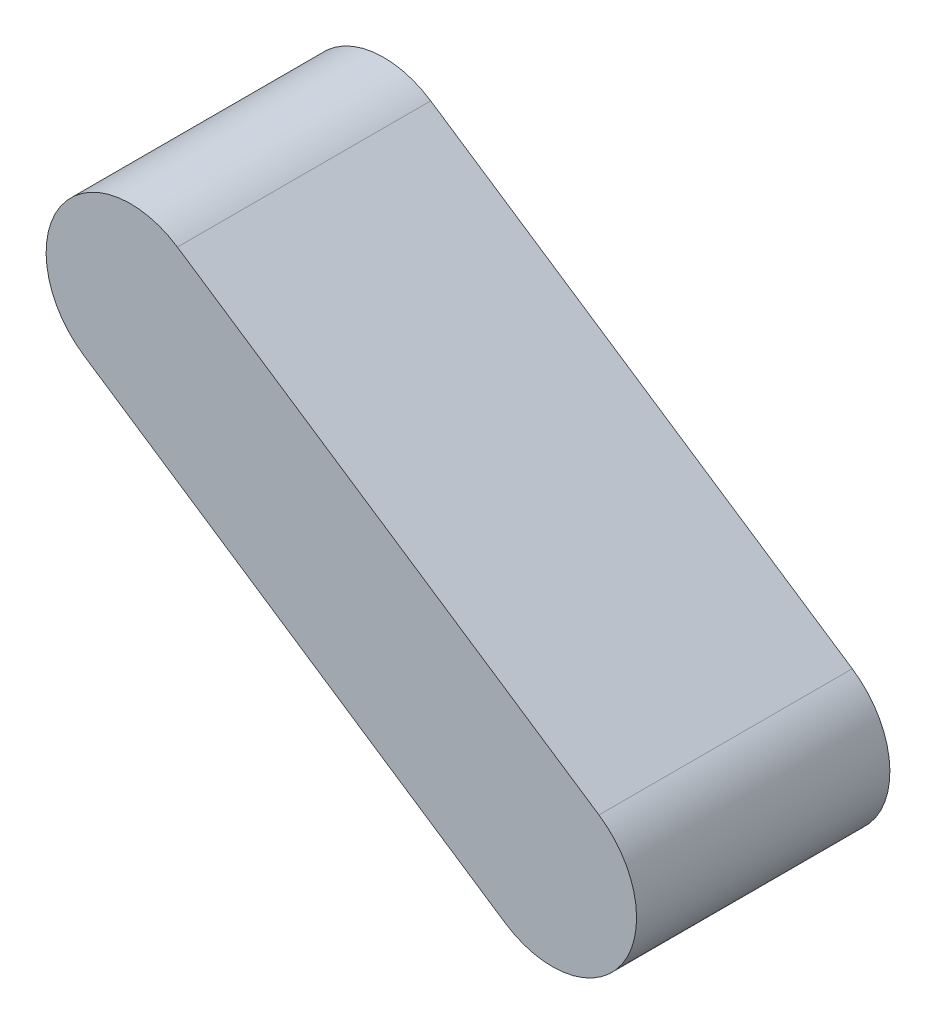
ISO-10303-21;
HEADER;
FILE_DESCRIPTION(('STEP AP214'),'2;1');
FILE_NAME('part.step','',(''),(''),'','','');
FILE_SCHEMA(('AUTOMOTIVE_DESIGN { 1 0 10303 214 1 1 1 1 }'));
ENDSEC;
DATA;
#1=APPLICATION_CONTEXT('core data for automotive mechanical design processes');
#2=APPLICATION_PROTOCOL_DEFINITION('international standard','automotive_design',2000,#1);
#3=PRODUCT_CONTEXT('',#1,'mechanical');
#4=PRODUCT('Part','Part','',(#3));
#5=PRODUCT_RELATED_PRODUCT_CATEGORY('part','',(#4));
#6=PRODUCT_DEFINITION_FORMATION('','',#4);
#7=PRODUCT_DEFINITION_CONTEXT('part definition',#1,'design');
#8=PRODUCT_DEFINITION('design','',#6,#7);
#9=PRODUCT_DEFINITION_SHAPE('','',#8);
#10=(LENGTH_UNIT() NAMED_UNIT(*) SI_UNIT(.MILLI.,.METRE.));
#11=(NAMED_UNIT(*) PLANE_ANGLE_UNIT() SI_UNIT($,.RADIAN.));
#12=(NAMED_UNIT(*) SI_UNIT($,.STERADIAN.) SOLID_ANGLE_UNIT());
#13=UNCERTAINTY_MEASURE_WITH_UNIT(LENGTH_MEASURE(1.E-05),#10,'distance_accuracy_value','');
#14=(GEOMETRIC_REPRESENTATION_CONTEXT(3) GLOBAL_UNCERTAINTY_ASSIGNED_CONTEXT((#13)) GLOBAL_UNIT_ASSIGNED_CONTEXT((#10,
#11,#12)) REPRESENTATION_CONTEXT('',''));
#15=CARTESIAN_POINT('',(0.,0.,0.));
#16=DIRECTION('',(0.,0.,1.));
#17=DIRECTION('',(1.,0.,0.));
#18=AXIS2_PLACEMENT_3D('',#15,#16,#17);
#19=CARTESIAN_POINT('',(0.,0.,15.));
#20=DIRECTION('',(0.,0.,-1.));
#21=DIRECTION('',(-1.,0.,0.));
#22=AXIS2_PLACEMENT_3D('',#19,#20,#21);
#23=CYLINDRICAL_SURFACE('',#22,10.);
#24=CARTESIAN_POINT('',(0.,0.,-15.));
#25=DIRECTION('',(0.,0.,1.));
#26=DIRECTION('',(1.,0.,0.));
#27=AXIS2_PLACEMENT_3D('',#24,#25,#26);
#28=CIRCLE('',#27,10.);
#29=CARTESIAN_POINT('',(-5.54634738523467,-8.32093929086739,-15.));
#30=VERTEX_POINT('',#29);
#31=CARTESIAN_POINT('',(5.54634738523467,8.32093929086739,-15.));
#32=VERTEX_POINT('',#31);
#33=EDGE_CURVE('E107',#30,#32,#28,.T.);
#34=ORIENTED_EDGE('',*,*,#33,.T.);
#35=DIRECTION('',(0.,0.,-1.));
#36=VECTOR('',#35,1.);
#37=CARTESIAN_POINT('',(5.54634738523467,8.32093929086739,15.));
#38=LINE('',#37,#36);
#39=CARTESIAN_POINT('',(5.54634738523467,8.32093929086739,15.));
#40=VERTEX_POINT('',#39);
#41=EDGE_CURVE('E11',#40,#32,#38,.T.);
#42=ORIENTED_EDGE('',*,*,#41,.F.);
#43=CARTESIAN_POINT('',(0.,0.,15.));
#44=DIRECTION('',(0.,0.,1.));
#45=DIRECTION('',(1.,0.,0.));
#46=AXIS2_PLACEMENT_3D('',#43,#44,#45);
#47=CIRCLE('',#46,10.);
#48=CARTESIAN_POINT('',(-5.54634738523467,-8.32093929086739,15.));
#49=VERTEX_POINT('',#48);
#50=EDGE_CURVE('E89',#49,#40,#47,.T.);
#51=ORIENTED_EDGE('',*,*,#50,.F.);
#52=DIRECTION('',(0.,0.,-1.));
#53=VECTOR('',#52,1.);
#54=CARTESIAN_POINT('',(-5.54634738523467,-8.32093929086739,15.));
#55=LINE('',#54,#53);
#56=EDGE_CURVE('E56',#49,#30,#55,.T.);
#57=ORIENTED_EDGE('',*,*,#56,.T.);
#58=EDGE_LOOP('',(#34,#42,#51,#57));
#59=FACE_BOUND('',#58,.T.);
#60=ADVANCED_FACE('F39',(#59),#23,.T.);
#61=CARTESIAN_POINT('',(5.54634738523467,8.32093929086739,15.));
#62=DIRECTION('',(-0.554634738523466,-0.832093929086739,0.));
#63=DIRECTION('',(0.832093929086739,-0.554634738523466,0.));
#64=AXIS2_PLACEMENT_3D('',#61,#62,#63);
#65=PLANE('',#64);
#66=DIRECTION('',(-0.832093929086739,0.554634738523466,0.));
#67=VECTOR('',#66,1.);
#68=CARTESIAN_POINT('',(5.54634738523467,8.32093929086739,-15.));
#69=LINE('',#68,#67);
#70=CARTESIAN_POINT('',(-44.3792883599697,41.5990236022754,-15.));
#71=VERTEX_POINT('',#70);
#72=EDGE_CURVE('E95',#32,#71,#69,.T.);
#73=ORIENTED_EDGE('',*,*,#72,.T.);
#74=DIRECTION('',(0.,0.,-1.));
#75=VECTOR('',#74,1.);
#76=CARTESIAN_POINT('',(-44.3792883599697,41.5990236022754,15.));
#77=LINE('',#76,#75);
#78=CARTESIAN_POINT('',(-44.3792883599697,41.5990236022754,15.));
#79=VERTEX_POINT('',#78);
#80=EDGE_CURVE('E48',#79,#71,#77,.T.);
#81=ORIENTED_EDGE('',*,*,#80,.F.);
#82=DIRECTION('',(-0.832093929086739,0.554634738523466,0.));
#83=VECTOR('',#82,1.);
#84=CARTESIAN_POINT('',(5.54634738523467,8.32093929086739,15.));
#85=LINE('',#84,#83);
#86=EDGE_CURVE('E82',#40,#79,#85,.T.);
#87=ORIENTED_EDGE('',*,*,#86,.F.);
#88=ORIENTED_EDGE('',*,*,#41,.T.);
#89=EDGE_LOOP('',(#73,#81,#87,#88));
#90=FACE_BOUND('',#89,.T.);
#91=ADVANCED_FACE('F94',(#90),#65,.F.);
#92=CARTESIAN_POINT('',(-49.9256357452043,33.278084311408,15.));
#93=DIRECTION('',(0.,0.,-1.));
#94=DIRECTION('',(-1.,0.,0.));
#95=AXIS2_PLACEMENT_3D('',#92,#93,#94);
#96=CYLINDRICAL_SURFACE('',#95,10.);
#97=CARTESIAN_POINT('',(-49.9256357452043,33.278084311408,-15.));
#98=DIRECTION('',(0.,0.,1.));
#99=DIRECTION('',(1.,0.,0.));
#100=AXIS2_PLACEMENT_3D('',#97,#98,#99);
#101=CIRCLE('',#100,10.);
#102=CARTESIAN_POINT('',(-55.471983130439,24.9571450205406,-15.));
#103=VERTEX_POINT('',#102);
#104=EDGE_CURVE('E112',#71,#103,#101,.T.);
#105=ORIENTED_EDGE('',*,*,#104,.T.);
#106=DIRECTION('',(0.,0.,-1.));
#107=VECTOR('',#106,1.);
#108=CARTESIAN_POINT('',(-55.471983130439,24.9571450205406,15.));
#109=LINE('',#108,#107);
#110=CARTESIAN_POINT('',(-55.471983130439,24.9571450205406,15.));
#111=VERTEX_POINT('',#110);
#112=EDGE_CURVE('E71',#111,#103,#109,.T.);
#113=ORIENTED_EDGE('',*,*,#112,.F.);
#114=CARTESIAN_POINT('',(-49.9256357452043,33.278084311408,15.));
#115=DIRECTION('',(0.,0.,1.));
#116=DIRECTION('',(1.,0.,0.));
#117=AXIS2_PLACEMENT_3D('',#114,#115,#116);
#118=CIRCLE('',#117,10.);
#119=EDGE_CURVE('E88',#79,#111,#118,.T.);
#120=ORIENTED_EDGE('',*,*,#119,.F.);
#121=ORIENTED_EDGE('',*,*,#80,.T.);
#122=EDGE_LOOP('',(#105,#113,#120,#121));
#123=FACE_BOUND('',#122,.T.);
#124=ADVANCED_FACE('F99',(#123),#96,.T.);
#125=CARTESIAN_POINT('',(-5.54634738523467,-8.32093929086739,15.));
#126=DIRECTION('',(-0.554634738523466,-0.832093929086738,0.));
#127=DIRECTION('',(0.832093929086738,-0.554634738523466,0.));
#128=AXIS2_PLACEMENT_3D('',#125,#126,#127);
#129=PLANE('',#128);
#130=DIRECTION('',(-0.832093929086738,0.554634738523466,0.));
#131=VECTOR('',#130,1.);
#132=CARTESIAN_POINT('',(-5.54634738523467,-8.32093929086739,-15.));
#133=LINE('',#132,#131);
#134=EDGE_CURVE('E115',#30,#103,#133,.T.);
#135=ORIENTED_EDGE('',*,*,#134,.F.);
#136=ORIENTED_EDGE('',*,*,#56,.F.);
#137=DIRECTION('',(-0.832093929086738,0.554634738523466,0.));
#138=VECTOR('',#137,1.);
#139=CARTESIAN_POINT('',(-5.54634738523467,-8.32093929086739,15.));
#140=LINE('',#139,#138);
#141=EDGE_CURVE('E101',#49,#111,#140,.T.);
#142=ORIENTED_EDGE('',*,*,#141,.T.);
#143=ORIENTED_EDGE('',*,*,#112,.T.);
#144=EDGE_LOOP('',(#135,#136,#142,#143));
#145=FACE_BOUND('',#144,.T.);
#146=ADVANCED_FACE('F125',(#145),#129,.T.);
#147=CARTESIAN_POINT('',(0.,0.,15.));
#148=DIRECTION('',(0.,0.,1.));
#149=DIRECTION('',(1.,0.,0.));
#150=AXIS2_PLACEMENT_3D('',#147,#148,#149);
#151=PLANE('',#150);
#152=ORIENTED_EDGE('',*,*,#50,.T.);
#153=ORIENTED_EDGE('',*,*,#86,.T.);
#154=ORIENTED_EDGE('',*,*,#119,.T.);
#155=ORIENTED_EDGE('',*,*,#141,.F.);
#156=EDGE_LOOP('',(#152,#153,#154,#155));
#157=FACE_BOUND('',#156,.T.);
#158=ADVANCED_FACE('F85',(#157),#151,.T.);
#159=CARTESIAN_POINT('',(0.,0.,-15.));
#160=DIRECTION('',(0.,0.,1.));
#161=DIRECTION('',(1.,0.,0.));
#162=AXIS2_PLACEMENT_3D('',#159,#160,#161);
#163=PLANE('',#162);
#164=ORIENTED_EDGE('',*,*,#33,.F.);
#165=ORIENTED_EDGE('',*,*,#134,.T.);
#166=ORIENTED_EDGE('',*,*,#104,.F.);
#167=ORIENTED_EDGE('',*,*,#72,.F.);
#168=EDGE_LOOP('',(#164,#165,#166,#167));
#169=FACE_BOUND('',#168,.T.);
#170=ADVANCED_FACE('F124',(#169),#163,.F.);
#171=CLOSED_SHELL('',(#60,#91,#124,#146,#158,#170));
#172=MANIFOLD_SOLID_BREP('B2',#171);
#173=ADVANCED_BREP_SHAPE_REPRESENTATION('',(#18,#172),#14);
#174=SHAPE_DEFINITION_REPRESENTATION(#9,#173);
ENDSEC;
END-ISO-10303-21;
